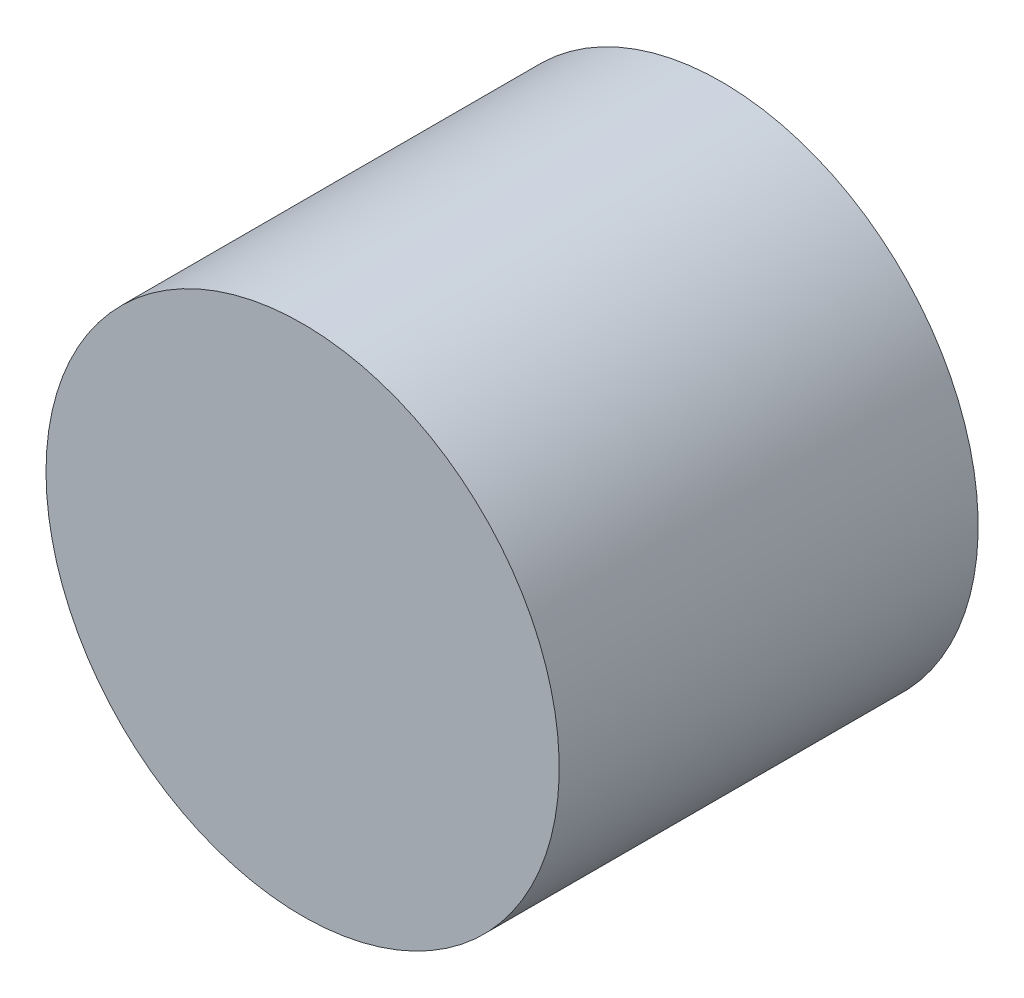
ISO-10303-21;
HEADER;
FILE_DESCRIPTION(('STEP AP214'),'2;1');
FILE_NAME('part.step','',(''),(''),'','','');
FILE_SCHEMA(('AUTOMOTIVE_DESIGN { 1 0 10303 214 1 1 1 1 }'));
ENDSEC;
DATA;
#1=APPLICATION_CONTEXT('core data for automotive mechanical design processes');
#2=APPLICATION_PROTOCOL_DEFINITION('international standard','automotive_design',2000,#1);
#3=PRODUCT_CONTEXT('',#1,'mechanical');
#4=PRODUCT('Part','Part','',(#3));
#5=PRODUCT_RELATED_PRODUCT_CATEGORY('part','',(#4));
#6=PRODUCT_DEFINITION_FORMATION('','',#4);
#7=PRODUCT_DEFINITION_CONTEXT('part definition',#1,'design');
#8=PRODUCT_DEFINITION('design','',#6,#7);
#9=PRODUCT_DEFINITION_SHAPE('','',#8);
#10=(LENGTH_UNIT() NAMED_UNIT(*) SI_UNIT(.MILLI.,.METRE.));
#11=(NAMED_UNIT(*) PLANE_ANGLE_UNIT() SI_UNIT($,.RADIAN.));
#12=(NAMED_UNIT(*) SI_UNIT($,.STERADIAN.) SOLID_ANGLE_UNIT());
#13=UNCERTAINTY_MEASURE_WITH_UNIT(LENGTH_MEASURE(1.E-05),#10,'distance_accuracy_value','');
#14=(GEOMETRIC_REPRESENTATION_CONTEXT(3) GLOBAL_UNCERTAINTY_ASSIGNED_CONTEXT((#13)) GLOBAL_UNIT_ASSIGNED_CONTEXT((#10,
#11,#12)) REPRESENTATION_CONTEXT('',''));
#15=CARTESIAN_POINT('',(0.,0.,0.));
#16=DIRECTION('',(0.,0.,1.));
#17=DIRECTION('',(1.,0.,0.));
#18=AXIS2_PLACEMENT_3D('',#15,#16,#17);
#19=CARTESIAN_POINT('',(-1.5,0.,1.2));
#20=DIRECTION('',(0.,0.,1.));
#21=DIRECTION('',(1.,0.,0.));
#22=AXIS2_PLACEMENT_3D('',#19,#20,#21);
#23=PLANE('',#22);
#24=CARTESIAN_POINT('',(0.,0.,1.2));
#25=DIRECTION('',(0.,0.,1.));
#26=DIRECTION('',(1.,0.,0.));
#27=AXIS2_PLACEMENT_3D('',#24,#25,#26);
#28=CIRCLE('',#27,2.45);
#29=CARTESIAN_POINT('',(-2.45,0.,1.2));
#30=VERTEX_POINT('',#29);
#31=EDGE_CURVE('E11',#30,#30,#28,.T.);
#32=ORIENTED_EDGE('',*,*,#31,.F.);
#33=EDGE_LOOP('',(#32));
#34=FACE_BOUND('',#33,.T.);
#35=ADVANCED_FACE('F16',(#34),#23,.F.);
#36=CARTESIAN_POINT('',(-1.5,0.,5.2));
#37=DIRECTION('',(0.,0.,1.));
#38=DIRECTION('',(1.,0.,0.));
#39=AXIS2_PLACEMENT_3D('',#36,#37,#38);
#40=PLANE('',#39);
#41=CARTESIAN_POINT('',(0.,0.,5.2));
#42=DIRECTION('',(0.,0.,1.));
#43=DIRECTION('',(1.,0.,0.));
#44=AXIS2_PLACEMENT_3D('',#41,#42,#43);
#45=CIRCLE('',#44,2.45);
#46=CARTESIAN_POINT('',(-2.45,0.,5.2));
#47=VERTEX_POINT('',#46);
#48=EDGE_CURVE('E40',#47,#47,#45,.T.);
#49=ORIENTED_EDGE('',*,*,#48,.T.);
#50=EDGE_LOOP('',(#49));
#51=FACE_BOUND('',#50,.T.);
#52=ADVANCED_FACE('F44',(#51),#40,.T.);
#53=CARTESIAN_POINT('',(0.,0.,1.2));
#54=DIRECTION('',(0.,0.,1.));
#55=DIRECTION('',(1.,0.,0.));
#56=AXIS2_PLACEMENT_3D('',#53,#54,#55);
#57=CYLINDRICAL_SURFACE('',#56,2.45);
#58=ORIENTED_EDGE('',*,*,#48,.F.);
#59=DIRECTION('',(0.,0.,-1.));
#60=VECTOR('',#59,1.);
#61=CARTESIAN_POINT('',(-2.45,0.,1.2));
#62=LINE('',#61,#60);
#63=EDGE_CURVE('E24',#47,#30,#62,.T.);
#64=ORIENTED_EDGE('',*,*,#63,.T.);
#65=ORIENTED_EDGE('',*,*,#31,.T.);
#66=ORIENTED_EDGE('',*,*,#63,.F.);
#67=EDGE_LOOP('',(#58,#64,#65,#66));
#68=FACE_BOUND('',#67,.T.);
#69=ADVANCED_FACE('F39',(#68),#57,.T.);
#70=CLOSED_SHELL('',(#35,#52,#69));
#71=MANIFOLD_SOLID_BREP('B1',#70);
#72=ADVANCED_BREP_SHAPE_REPRESENTATION('',(#18,#71),#14);
#73=SHAPE_DEFINITION_REPRESENTATION(#9,#72);
ENDSEC;
END-ISO-10303-21;
